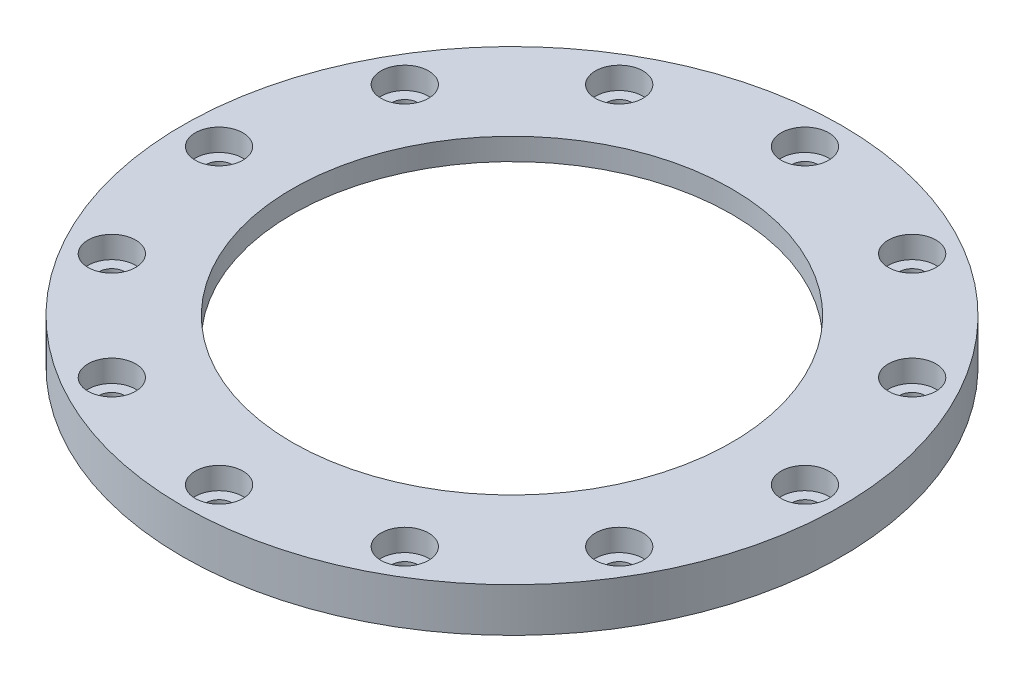
ISO-10303-21;
HEADER;
FILE_DESCRIPTION(('STEP AP214'),'2;1');
FILE_NAME('part.step','',(''),(''),'','','');
FILE_SCHEMA(('AUTOMOTIVE_DESIGN { 1 0 10303 214 1 1 1 1 }'));
ENDSEC;
DATA;
#1=APPLICATION_CONTEXT('core data for automotive mechanical design processes');
#2=APPLICATION_PROTOCOL_DEFINITION('international standard','automotive_design',2000,#1);
#3=PRODUCT_CONTEXT('',#1,'mechanical');
#4=PRODUCT('Part','Part','',(#3));
#5=PRODUCT_RELATED_PRODUCT_CATEGORY('part','',(#4));
#6=PRODUCT_DEFINITION_FORMATION('','',#4);
#7=PRODUCT_DEFINITION_CONTEXT('part definition',#1,'design');
#8=PRODUCT_DEFINITION('design','',#6,#7);
#9=PRODUCT_DEFINITION_SHAPE('','',#8);
#10=(LENGTH_UNIT() NAMED_UNIT(*) SI_UNIT(.MILLI.,.METRE.));
#11=(NAMED_UNIT(*) PLANE_ANGLE_UNIT() SI_UNIT($,.RADIAN.));
#12=(NAMED_UNIT(*) SI_UNIT($,.STERADIAN.) SOLID_ANGLE_UNIT());
#13=UNCERTAINTY_MEASURE_WITH_UNIT(LENGTH_MEASURE(1.E-05),#10,'distance_accuracy_value','');
#14=(GEOMETRIC_REPRESENTATION_CONTEXT(3) GLOBAL_UNCERTAINTY_ASSIGNED_CONTEXT((#13)) GLOBAL_UNIT_ASSIGNED_CONTEXT((#10,
#11,#12)) REPRESENTATION_CONTEXT('',''));
#15=CARTESIAN_POINT('',(0.,0.,0.));
#16=DIRECTION('',(0.,0.,1.));
#17=DIRECTION('',(1.,0.,0.));
#18=AXIS2_PLACEMENT_3D('',#15,#16,#17);
#19=CARTESIAN_POINT('',(0.,6.,-40.));
#20=DIRECTION('',(0.,-1.,0.));
#21=DIRECTION('',(0.,0.,-1.));
#22=AXIS2_PLACEMENT_3D('',#19,#20,#21);
#23=CYLINDRICAL_SURFACE('',#22,1.75);
#24=CARTESIAN_POINT('',(0.,0.,-40.));
#25=DIRECTION('',(0.,1.,0.));
#26=DIRECTION('',(0.,0.,1.));
#27=AXIS2_PLACEMENT_3D('',#24,#25,#26);
#28=CIRCLE('',#27,1.75);
#29=CARTESIAN_POINT('',(0.,0.,-38.25));
#30=VERTEX_POINT('',#29);
#31=EDGE_CURVE('E137',#30,#30,#28,.T.);
#32=ORIENTED_EDGE('',*,*,#31,.F.);
#33=EDGE_LOOP('',(#32));
#34=FACE_BOUND('',#33,.T.);
#35=CARTESIAN_POINT('',(0.,3.,-40.));
#36=DIRECTION('',(0.,1.,0.));
#37=DIRECTION('',(0.,0.,1.));
#38=AXIS2_PLACEMENT_3D('',#35,#36,#37);
#39=CIRCLE('',#38,1.75);
#40=CARTESIAN_POINT('',(0.,3.,-38.25));
#41=VERTEX_POINT('',#40);
#42=EDGE_CURVE('E35',#41,#41,#39,.T.);
#43=ORIENTED_EDGE('',*,*,#42,.T.);
#44=EDGE_LOOP('',(#43));
#45=FACE_BOUND('',#44,.T.);
#46=ADVANCED_FACE('F31',(#34,#45),#23,.F.);
#47=CARTESIAN_POINT('',(20.0000000000008,6.,-34.6410161513804));
#48=DIRECTION('',(0.,-1.,0.));
#49=DIRECTION('',(0.,0.,-1.));
#50=AXIS2_PLACEMENT_3D('',#47,#48,#49);
#51=CYLINDRICAL_SURFACE('',#50,1.74999999999994);
#52=CARTESIAN_POINT('',(20.0000000000008,0.,-34.6410161513804));
#53=DIRECTION('',(0.,1.,0.));
#54=DIRECTION('',(0.,0.,1.));
#55=AXIS2_PLACEMENT_3D('',#52,#53,#54);
#56=CIRCLE('',#55,1.74999999999994);
#57=CARTESIAN_POINT('',(20.0000000000008,0.,-32.8910161513804));
#58=VERTEX_POINT('',#57);
#59=EDGE_CURVE('E135',#58,#58,#56,.T.);
#60=ORIENTED_EDGE('',*,*,#59,.F.);
#61=EDGE_LOOP('',(#60));
#62=FACE_BOUND('',#61,.T.);
#63=CARTESIAN_POINT('',(20.0000000000008,3.,-34.6410161513804));
#64=DIRECTION('',(0.,1.,0.));
#65=DIRECTION('',(0.,0.,1.));
#66=AXIS2_PLACEMENT_3D('',#63,#64,#65);
#67=CIRCLE('',#66,1.74999999999994);
#68=CARTESIAN_POINT('',(20.0000000000008,3.,-32.8910161513804));
#69=VERTEX_POINT('',#68);
#70=EDGE_CURVE('E86',#69,#69,#67,.T.);
#71=ORIENTED_EDGE('',*,*,#70,.T.);
#72=EDGE_LOOP('',(#71));
#73=FACE_BOUND('',#72,.T.);
#74=ADVANCED_FACE('F162',(#62,#73),#51,.F.);
#75=CARTESIAN_POINT('',(34.6410161513804,6.,-20.0000000000049));
#76=DIRECTION('',(0.,-1.,0.));
#77=DIRECTION('',(0.,0.,-1.));
#78=AXIS2_PLACEMENT_3D('',#75,#76,#77);
#79=CYLINDRICAL_SURFACE('',#78,1.75000000000137);
#80=CARTESIAN_POINT('',(34.6410161513804,0.,-20.0000000000049));
#81=DIRECTION('',(0.,1.,0.));
#82=DIRECTION('',(0.,0.,1.));
#83=AXIS2_PLACEMENT_3D('',#80,#81,#82);
#84=CIRCLE('',#83,1.75000000000137);
#85=CARTESIAN_POINT('',(34.6410161513804,0.,-18.2500000000036));
#86=VERTEX_POINT('',#85);
#87=EDGE_CURVE('E132',#86,#86,#84,.T.);
#88=ORIENTED_EDGE('',*,*,#87,.F.);
#89=EDGE_LOOP('',(#88));
#90=FACE_BOUND('',#89,.T.);
#91=CARTESIAN_POINT('',(34.6410161513804,3.,-20.0000000000049));
#92=DIRECTION('',(0.,1.,0.));
#93=DIRECTION('',(0.,0.,1.));
#94=AXIS2_PLACEMENT_3D('',#91,#92,#93);
#95=CIRCLE('',#94,1.75000000000137);
#96=CARTESIAN_POINT('',(34.6410161513804,3.,-18.2500000000036));
#97=VERTEX_POINT('',#96);
#98=EDGE_CURVE('E84',#97,#97,#95,.T.);
#99=ORIENTED_EDGE('',*,*,#98,.T.);
#100=EDGE_LOOP('',(#99));
#101=FACE_BOUND('',#100,.T.);
#102=ADVANCED_FACE('F168',(#90,#101),#79,.F.);
#103=CARTESIAN_POINT('',(34.6410161513861,6.,19.9999999999951));
#104=DIRECTION('',(0.,-1.,0.));
#105=DIRECTION('',(0.,0.,-1.));
#106=AXIS2_PLACEMENT_3D('',#103,#104,#105);
#107=CYLINDRICAL_SURFACE('',#106,1.75000000000689);
#108=CARTESIAN_POINT('',(34.6410161513861,0.,19.9999999999951));
#109=DIRECTION('',(0.,1.,0.));
#110=DIRECTION('',(0.,0.,1.));
#111=AXIS2_PLACEMENT_3D('',#108,#109,#110);
#112=CIRCLE('',#111,1.75000000000689);
#113=CARTESIAN_POINT('',(34.6410161513861,0.,21.750000000002));
#114=VERTEX_POINT('',#113);
#115=EDGE_CURVE('E126',#114,#114,#112,.T.);
#116=ORIENTED_EDGE('',*,*,#115,.F.);
#117=EDGE_LOOP('',(#116));
#118=FACE_BOUND('',#117,.T.);
#119=CARTESIAN_POINT('',(34.6410161513861,3.,19.9999999999951));
#120=DIRECTION('',(0.,1.,0.));
#121=DIRECTION('',(0.,0.,1.));
#122=AXIS2_PLACEMENT_3D('',#119,#120,#121);
#123=CIRCLE('',#122,1.75000000000689);
#124=CARTESIAN_POINT('',(34.6410161513861,3.,21.750000000002));
#125=VERTEX_POINT('',#124);
#126=EDGE_CURVE('E81',#125,#125,#123,.T.);
#127=ORIENTED_EDGE('',*,*,#126,.T.);
#128=EDGE_LOOP('',(#127));
#129=FACE_BOUND('',#128,.T.);
#130=ADVANCED_FACE('F174',(#118,#129),#107,.F.);
#131=CARTESIAN_POINT('',(20.0000000000106,6.,34.6410161513747));
#132=DIRECTION('',(0.,-1.,0.));
#133=DIRECTION('',(0.,0.,-1.));
#134=AXIS2_PLACEMENT_3D('',#131,#132,#133);
#135=CYLINDRICAL_SURFACE('',#134,1.75000000000955);
#136=CARTESIAN_POINT('',(20.0000000000106,0.,34.6410161513747));
#137=DIRECTION('',(0.,1.,0.));
#138=DIRECTION('',(0.,0.,1.));
#139=AXIS2_PLACEMENT_3D('',#136,#137,#138);
#140=CIRCLE('',#139,1.75000000000955);
#141=CARTESIAN_POINT('',(20.0000000000106,0.,36.3910161513842));
#142=VERTEX_POINT('',#141);
#143=EDGE_CURVE('E123',#142,#142,#140,.T.);
#144=ORIENTED_EDGE('',*,*,#143,.F.);
#145=EDGE_LOOP('',(#144));
#146=FACE_BOUND('',#145,.T.);
#147=CARTESIAN_POINT('',(20.0000000000106,3.,34.6410161513747));
#148=DIRECTION('',(0.,1.,0.));
#149=DIRECTION('',(0.,0.,1.));
#150=AXIS2_PLACEMENT_3D('',#147,#148,#149);
#151=CIRCLE('',#150,1.75000000000955);
#152=CARTESIAN_POINT('',(20.0000000000106,3.,36.3910161513842));
#153=VERTEX_POINT('',#152);
#154=EDGE_CURVE('E78',#153,#153,#151,.T.);
#155=ORIENTED_EDGE('',*,*,#154,.T.);
#156=EDGE_LOOP('',(#155));
#157=FACE_BOUND('',#156,.T.);
#158=ADVANCED_FACE('F182',(#146,#157),#135,.F.);
#159=CARTESIAN_POINT('',(1.13588865977684E-11,6.,40.));
#160=DIRECTION('',(0.,-1.,0.));
#161=DIRECTION('',(0.,0.,-1.));
#162=AXIS2_PLACEMENT_3D('',#159,#160,#161);
#163=CYLINDRICAL_SURFACE('',#162,1.75000000001113);
#164=CARTESIAN_POINT('',(1.13588865977684E-11,0.,40.));
#165=DIRECTION('',(0.,1.,0.));
#166=DIRECTION('',(0.,0.,1.));
#167=AXIS2_PLACEMENT_3D('',#164,#165,#166);
#168=CIRCLE('',#167,1.75000000001113);
#169=CARTESIAN_POINT('',(1.13588865977684E-11,0.,41.7500000000111));
#170=VERTEX_POINT('',#169);
#171=EDGE_CURVE('E120',#170,#170,#168,.T.);
#172=ORIENTED_EDGE('',*,*,#171,.F.);
#173=EDGE_LOOP('',(#172));
#174=FACE_BOUND('',#173,.T.);
#175=CARTESIAN_POINT('',(1.13588865977684E-11,3.,40.));
#176=DIRECTION('',(0.,1.,0.));
#177=DIRECTION('',(0.,0.,1.));
#178=AXIS2_PLACEMENT_3D('',#175,#176,#177);
#179=CIRCLE('',#178,1.75000000001113);
#180=CARTESIAN_POINT('',(1.13588865977684E-11,3.,41.7500000000111));
#181=VERTEX_POINT('',#180);
#182=EDGE_CURVE('E75',#181,#181,#179,.T.);
#183=ORIENTED_EDGE('',*,*,#182,.T.);
#184=EDGE_LOOP('',(#183));
#185=FACE_BOUND('',#184,.T.);
#186=ADVANCED_FACE('F186',(#174,#185),#163,.F.);
#187=CARTESIAN_POINT('',(-19.9999999999894,6.,34.6410161513804));
#188=DIRECTION('',(0.,-1.,0.));
#189=DIRECTION('',(0.,0.,-1.));
#190=AXIS2_PLACEMENT_3D('',#187,#188,#189);
#191=CYLINDRICAL_SURFACE('',#190,1.75000000001128);
#192=CARTESIAN_POINT('',(-19.9999999999894,0.,34.6410161513804));
#193=DIRECTION('',(0.,1.,0.));
#194=DIRECTION('',(0.,0.,1.));
#195=AXIS2_PLACEMENT_3D('',#192,#193,#194);
#196=CIRCLE('',#195,1.75000000001128);
#197=CARTESIAN_POINT('',(-19.9999999999894,0.,36.3910161513917));
#198=VERTEX_POINT('',#197);
#199=EDGE_CURVE('E117',#198,#198,#196,.T.);
#200=ORIENTED_EDGE('',*,*,#199,.F.);
#201=EDGE_LOOP('',(#200));
#202=FACE_BOUND('',#201,.T.);
#203=CARTESIAN_POINT('',(-19.9999999999894,3.,34.6410161513804));
#204=DIRECTION('',(0.,1.,0.));
#205=DIRECTION('',(0.,0.,1.));
#206=AXIS2_PLACEMENT_3D('',#203,#204,#205);
#207=CIRCLE('',#206,1.75000000001128);
#208=CARTESIAN_POINT('',(-19.9999999999894,3.,36.3910161513917));
#209=VERTEX_POINT('',#208);
#210=EDGE_CURVE('E72',#209,#209,#207,.T.);
#211=ORIENTED_EDGE('',*,*,#210,.T.);
#212=EDGE_LOOP('',(#211));
#213=FACE_BOUND('',#212,.T.);
#214=ADVANCED_FACE('F190',(#202,#213),#191,.F.);
#215=CARTESIAN_POINT('',(-34.641016151369,6.,20.0000000000049));
#216=DIRECTION('',(0.,-1.,0.));
#217=DIRECTION('',(0.,0.,-1.));
#218=AXIS2_PLACEMENT_3D('',#215,#216,#217);
#219=CYLINDRICAL_SURFACE('',#218,1.75000000000994);
#220=CARTESIAN_POINT('',(-34.641016151369,0.,20.0000000000049));
#221=DIRECTION('',(0.,1.,0.));
#222=DIRECTION('',(0.,0.,1.));
#223=AXIS2_PLACEMENT_3D('',#220,#221,#222);
#224=CIRCLE('',#223,1.75000000000994);
#225=CARTESIAN_POINT('',(-34.641016151369,0.,21.7500000000149));
#226=VERTEX_POINT('',#225);
#227=EDGE_CURVE('E114',#226,#226,#224,.T.);
#228=ORIENTED_EDGE('',*,*,#227,.F.);
#229=EDGE_LOOP('',(#228));
#230=FACE_BOUND('',#229,.T.);
#231=CARTESIAN_POINT('',(-34.641016151369,3.,20.0000000000049));
#232=DIRECTION('',(0.,1.,0.));
#233=DIRECTION('',(0.,0.,1.));
#234=AXIS2_PLACEMENT_3D('',#231,#232,#233);
#235=CIRCLE('',#234,1.75000000000994);
#236=CARTESIAN_POINT('',(-34.641016151369,3.,21.7500000000149));
#237=VERTEX_POINT('',#236);
#238=EDGE_CURVE('E69',#237,#237,#235,.T.);
#239=ORIENTED_EDGE('',*,*,#238,.T.);
#240=EDGE_LOOP('',(#239));
#241=FACE_BOUND('',#240,.T.);
#242=ADVANCED_FACE('F194',(#230,#241),#219,.F.);
#243=CARTESIAN_POINT('',(-39.9999999999943,6.,5.6843418860808E-12));
#244=DIRECTION('',(0.,-1.,0.));
#245=DIRECTION('',(0.,0.,-1.));
#246=AXIS2_PLACEMENT_3D('',#243,#244,#245);
#247=CYLINDRICAL_SURFACE('',#246,1.75000000000749);
#248=CARTESIAN_POINT('',(-39.9999999999943,0.,5.6843418860808E-12));
#249=DIRECTION('',(0.,1.,0.));
#250=DIRECTION('',(0.,0.,1.));
#251=AXIS2_PLACEMENT_3D('',#248,#249,#250);
#252=CIRCLE('',#251,1.75000000000749);
#253=CARTESIAN_POINT('',(-39.9999999999943,0.,1.75000000001318));
#254=VERTEX_POINT('',#253);
#255=EDGE_CURVE('E111',#254,#254,#252,.T.);
#256=ORIENTED_EDGE('',*,*,#255,.F.);
#257=EDGE_LOOP('',(#256));
#258=FACE_BOUND('',#257,.T.);
#259=CARTESIAN_POINT('',(-39.9999999999943,3.,5.6843418860808E-12));
#260=DIRECTION('',(0.,1.,0.));
#261=DIRECTION('',(0.,0.,1.));
#262=AXIS2_PLACEMENT_3D('',#259,#260,#261);
#263=CIRCLE('',#262,1.75000000000749);
#264=CARTESIAN_POINT('',(-39.9999999999943,3.,1.75000000001318));
#265=VERTEX_POINT('',#264);
#266=EDGE_CURVE('E66',#265,#265,#263,.T.);
#267=ORIENTED_EDGE('',*,*,#266,.T.);
#268=EDGE_LOOP('',(#267));
#269=FACE_BOUND('',#268,.T.);
#270=ADVANCED_FACE('F198',(#258,#269),#247,.F.);
#271=CARTESIAN_POINT('',(-34.6410161513747,6.,-19.9999999999951));
#272=DIRECTION('',(0.,-1.,0.));
#273=DIRECTION('',(0.,0.,-1.));
#274=AXIS2_PLACEMENT_3D('',#271,#272,#273);
#275=CYLINDRICAL_SURFACE('',#274,1.75000000000464);
#276=CARTESIAN_POINT('',(-34.6410161513747,0.,-19.9999999999951));
#277=DIRECTION('',(0.,1.,0.));
#278=DIRECTION('',(0.,0.,1.));
#279=AXIS2_PLACEMENT_3D('',#276,#277,#278);
#280=CIRCLE('',#279,1.75000000000464);
#281=CARTESIAN_POINT('',(-34.6410161513747,0.,-18.2499999999904));
#282=VERTEX_POINT('',#281);
#283=EDGE_CURVE('E108',#282,#282,#280,.T.);
#284=ORIENTED_EDGE('',*,*,#283,.F.);
#285=EDGE_LOOP('',(#284));
#286=FACE_BOUND('',#285,.T.);
#287=CARTESIAN_POINT('',(-34.6410161513747,3.,-19.9999999999951));
#288=DIRECTION('',(0.,1.,0.));
#289=DIRECTION('',(0.,0.,1.));
#290=AXIS2_PLACEMENT_3D('',#287,#288,#289);
#291=CIRCLE('',#290,1.75000000000464);
#292=CARTESIAN_POINT('',(-34.6410161513747,3.,-18.2499999999904));
#293=VERTEX_POINT('',#292);
#294=EDGE_CURVE('E62',#293,#293,#291,.T.);
#295=ORIENTED_EDGE('',*,*,#294,.T.);
#296=EDGE_LOOP('',(#295));
#297=FACE_BOUND('',#296,.T.);
#298=ADVANCED_FACE('F202',(#286,#297),#275,.F.);
#299=CARTESIAN_POINT('',(-19.9999999999993,6.,-34.6410161513747));
#300=DIRECTION('',(0.,-1.,0.));
#301=DIRECTION('',(0.,0.,-1.));
#302=AXIS2_PLACEMENT_3D('',#299,#300,#301);
#303=CYLINDRICAL_SURFACE('',#302,1.75000000000208);
#304=CARTESIAN_POINT('',(-19.9999999999993,0.,-34.6410161513747));
#305=DIRECTION('',(0.,1.,0.));
#306=DIRECTION('',(0.,0.,1.));
#307=AXIS2_PLACEMENT_3D('',#304,#305,#306);
#308=CIRCLE('',#307,1.75000000000208);
#309=CARTESIAN_POINT('',(-19.9999999999993,0.,-32.8910161513726));
#310=VERTEX_POINT('',#309);
#311=EDGE_CURVE('E52',#310,#310,#308,.T.);
#312=ORIENTED_EDGE('',*,*,#311,.F.);
#313=EDGE_LOOP('',(#312));
#314=FACE_BOUND('',#313,.T.);
#315=CARTESIAN_POINT('',(-19.9999999999993,3.,-34.6410161513747));
#316=DIRECTION('',(0.,1.,0.));
#317=DIRECTION('',(0.,0.,1.));
#318=AXIS2_PLACEMENT_3D('',#315,#316,#317);
#319=CIRCLE('',#318,1.75000000000208);
#320=CARTESIAN_POINT('',(-19.9999999999993,3.,-32.8910161513726));
#321=VERTEX_POINT('',#320);
#322=EDGE_CURVE('E59',#321,#321,#319,.T.);
#323=ORIENTED_EDGE('',*,*,#322,.T.);
#324=EDGE_LOOP('',(#323));
#325=FACE_BOUND('',#324,.T.);
#326=ADVANCED_FACE('F178',(#314,#325),#303,.F.);
#327=CARTESIAN_POINT('',(40.0000000000057,6.,-5.67944329888421E-12));
#328=DIRECTION('',(0.,-1.,0.));
#329=DIRECTION('',(0.,0.,-1.));
#330=AXIS2_PLACEMENT_3D('',#327,#328,#329);
#331=CYLINDRICAL_SURFACE('',#330,1.75000000000391);
#332=CARTESIAN_POINT('',(40.0000000000057,0.,-5.67944329888421E-12));
#333=DIRECTION('',(0.,1.,0.));
#334=DIRECTION('',(0.,0.,1.));
#335=AXIS2_PLACEMENT_3D('',#332,#333,#334);
#336=CIRCLE('',#335,1.75000000000391);
#337=CARTESIAN_POINT('',(40.0000000000057,0.,1.74999999999823));
#338=VERTEX_POINT('',#337);
#339=EDGE_CURVE('E129',#338,#338,#336,.T.);
#340=ORIENTED_EDGE('',*,*,#339,.F.);
#341=EDGE_LOOP('',(#340));
#342=FACE_BOUND('',#341,.T.);
#343=CARTESIAN_POINT('',(40.0000000000057,3.,-5.67944329888421E-12));
#344=DIRECTION('',(0.,1.,0.));
#345=DIRECTION('',(0.,0.,1.));
#346=AXIS2_PLACEMENT_3D('',#343,#344,#345);
#347=CIRCLE('',#346,1.75000000000391);
#348=CARTESIAN_POINT('',(40.0000000000057,3.,1.74999999999823));
#349=VERTEX_POINT('',#348);
#350=EDGE_CURVE('E54',#349,#349,#347,.T.);
#351=ORIENTED_EDGE('',*,*,#350,.T.);
#352=EDGE_LOOP('',(#351));
#353=FACE_BOUND('',#352,.T.);
#354=ADVANCED_FACE('F157',(#342,#353),#331,.F.);
#355=CARTESIAN_POINT('',(0.,6.,0.));
#356=DIRECTION('',(0.,-1.,0.));
#357=DIRECTION('',(0.,0.,-1.));
#358=AXIS2_PLACEMENT_3D('',#355,#356,#357);
#359=CYLINDRICAL_SURFACE('',#358,30.);
#360=CARTESIAN_POINT('',(0.,6.,0.));
#361=DIRECTION('',(0.,1.,0.));
#362=DIRECTION('',(0.,0.,1.));
#363=AXIS2_PLACEMENT_3D('',#360,#361,#362);
#364=CIRCLE('',#363,30.);
#365=CARTESIAN_POINT('',(0.,6.,30.));
#366=VERTEX_POINT('',#365);
#367=EDGE_CURVE('E44',#366,#366,#364,.T.);
#368=ORIENTED_EDGE('',*,*,#367,.T.);
#369=EDGE_LOOP('',(#368));
#370=FACE_BOUND('',#369,.T.);
#371=CARTESIAN_POINT('',(0.,3.,0.));
#372=DIRECTION('',(0.,-1.,0.));
#373=DIRECTION('',(0.,0.,-1.));
#374=AXIS2_PLACEMENT_3D('',#371,#372,#373);
#375=CIRCLE('',#374,30.);
#376=CARTESIAN_POINT('',(0.,3.,-30.));
#377=VERTEX_POINT('',#376);
#378=EDGE_CURVE('E49',#377,#377,#375,.T.);
#379=ORIENTED_EDGE('',*,*,#378,.T.);
#380=EDGE_LOOP('',(#379));
#381=FACE_BOUND('',#380,.T.);
#382=ADVANCED_FACE('F144',(#370,#381),#359,.F.);
#383=CARTESIAN_POINT('',(0.,6.,0.));
#384=DIRECTION('',(0.,1.,0.));
#385=DIRECTION('',(0.,0.,1.));
#386=AXIS2_PLACEMENT_3D('',#383,#384,#385);
#387=PLANE('',#386);
#388=CARTESIAN_POINT('',(34.6410161513881,6.,19.9999999999987));
#389=DIRECTION('',(0.,1.,0.));
#390=DIRECTION('',(0.,0.,1.));
#391=AXIS2_PLACEMENT_3D('',#388,#389,#390);
#392=CIRCLE('',#391,3.25);
#393=CARTESIAN_POINT('',(34.6410161513881,6.,23.2499999999987));
#394=VERTEX_POINT('',#393);
#395=EDGE_CURVE('E319',#394,#394,#392,.T.);
#396=ORIENTED_EDGE('',*,*,#395,.F.);
#397=EDGE_LOOP('',(#396));
#398=FACE_BOUND('',#397,.T.);
#399=CARTESIAN_POINT('',(20.0000000000125,6.,34.6410161513824));
#400=DIRECTION('',(0.,1.,0.));
#401=DIRECTION('',(0.,0.,1.));
#402=AXIS2_PLACEMENT_3D('',#399,#400,#401);
#403=CIRCLE('',#402,3.25);
#404=CARTESIAN_POINT('',(20.0000000000125,6.,37.8910161513824));
#405=VERTEX_POINT('',#404);
#406=EDGE_CURVE('E327',#405,#405,#403,.T.);
#407=ORIENTED_EDGE('',*,*,#406,.F.);
#408=EDGE_LOOP('',(#407));
#409=FACE_BOUND('',#408,.T.);
#410=CARTESIAN_POINT('',(1.11885987946249E-11,6.,40.0000000000112));
#411=DIRECTION('',(0.,1.,0.));
#412=DIRECTION('',(0.,0.,1.));
#413=AXIS2_PLACEMENT_3D('',#410,#411,#412);
#414=CIRCLE('',#413,3.25);
#415=CARTESIAN_POINT('',(1.11885987946249E-11,6.,43.2500000000112));
#416=VERTEX_POINT('',#415);
#417=EDGE_CURVE('E333',#416,#416,#414,.T.);
#418=ORIENTED_EDGE('',*,*,#417,.F.);
#419=EDGE_LOOP('',(#418));
#420=FACE_BOUND('',#419,.T.);
#421=CARTESIAN_POINT('',(-19.9999999999931,6.,34.6410161513936));
#422=DIRECTION('',(0.,1.,0.));
#423=DIRECTION('',(0.,0.,1.));
#424=AXIS2_PLACEMENT_3D('',#421,#422,#423);
#425=CIRCLE('',#424,3.25);
#426=CARTESIAN_POINT('',(-19.9999999999931,6.,37.8910161513936));
#427=VERTEX_POINT('',#426);
#428=EDGE_CURVE('E339',#427,#427,#425,.T.);
#429=ORIENTED_EDGE('',*,*,#428,.F.);
#430=EDGE_LOOP('',(#429));
#431=FACE_BOUND('',#430,.T.);
#432=CARTESIAN_POINT('',(-34.6410161513769,6.,20.000000000018));
#433=DIRECTION('',(0.,1.,0.));
#434=DIRECTION('',(0.,0.,1.));
#435=AXIS2_PLACEMENT_3D('',#432,#433,#434);
#436=CIRCLE('',#435,3.25);
#437=CARTESIAN_POINT('',(-34.6410161513769,6.,23.250000000018));
#438=VERTEX_POINT('',#437);
#439=EDGE_CURVE('E345',#438,#438,#436,.T.);
#440=ORIENTED_EDGE('',*,*,#439,.F.);
#441=EDGE_LOOP('',(#440));
#442=FACE_BOUND('',#441,.T.);
#443=CARTESIAN_POINT('',(-40.0000000000057,6.,1.66977542903655E-11));
#444=DIRECTION('',(0.,1.,0.));
#445=DIRECTION('',(0.,0.,1.));
#446=AXIS2_PLACEMENT_3D('',#443,#444,#445);
#447=CIRCLE('',#446,3.25);
#448=CARTESIAN_POINT('',(-40.0000000000057,6.,3.2500000000167));
#449=VERTEX_POINT('',#448);
#450=EDGE_CURVE('E351',#449,#449,#447,.T.);
#451=ORIENTED_EDGE('',*,*,#450,.F.);
#452=EDGE_LOOP('',(#451));
#453=FACE_BOUND('',#452,.T.);
#454=CARTESIAN_POINT('',(-34.6410161513881,6.,-19.9999999999876));
#455=DIRECTION('',(0.,1.,0.));
#456=DIRECTION('',(0.,0.,1.));
#457=AXIS2_PLACEMENT_3D('',#454,#455,#456);
#458=CIRCLE('',#457,3.25);
#459=CARTESIAN_POINT('',(-34.6410161513881,6.,-16.7499999999876));
#460=VERTEX_POINT('',#459);
#461=EDGE_CURVE('E357',#460,#460,#458,.T.);
#462=ORIENTED_EDGE('',*,*,#461,.F.);
#463=EDGE_LOOP('',(#462));
#464=FACE_BOUND('',#463,.T.);
#465=CARTESIAN_POINT('',(-20.0000000000125,6.,-34.6410161513714));
#466=DIRECTION('',(0.,1.,0.));
#467=DIRECTION('',(0.,0.,1.));
#468=AXIS2_PLACEMENT_3D('',#465,#466,#467);
#469=CIRCLE('',#468,3.25);
#470=CARTESIAN_POINT('',(-20.0000000000125,6.,-31.3910161513714));
#471=VERTEX_POINT('',#470);
#472=EDGE_CURVE('E363',#471,#471,#469,.T.);
#473=ORIENTED_EDGE('',*,*,#472,.F.);
#474=EDGE_LOOP('',(#473));
#475=FACE_BOUND('',#474,.T.);
#476=CARTESIAN_POINT('',(-1.11934973818215E-11,6.,-40.0000000000002));
#477=DIRECTION('',(0.,1.,0.));
#478=DIRECTION('',(0.,0.,1.));
#479=AXIS2_PLACEMENT_3D('',#476,#477,#478);
#480=CIRCLE('',#479,3.25);
#481=CARTESIAN_POINT('',(-1.11934973818215E-11,6.,-36.7500000000002));
#482=VERTEX_POINT('',#481);
#483=EDGE_CURVE('E369',#482,#482,#480,.T.);
#484=ORIENTED_EDGE('',*,*,#483,.F.);
#485=EDGE_LOOP('',(#484));
#486=FACE_BOUND('',#485,.T.);
#487=CARTESIAN_POINT('',(19.9999999999931,6.,-34.6410161513826));
#488=DIRECTION('',(0.,1.,0.));
#489=DIRECTION('',(0.,0.,1.));
#490=AXIS2_PLACEMENT_3D('',#487,#488,#489);
#491=CIRCLE('',#490,3.25);
#492=CARTESIAN_POINT('',(19.9999999999931,6.,-31.3910161513826));
#493=VERTEX_POINT('',#492);
#494=EDGE_CURVE('E375',#493,#493,#491,.T.);
#495=ORIENTED_EDGE('',*,*,#494,.F.);
#496=EDGE_LOOP('',(#495));
#497=FACE_BOUND('',#496,.T.);
#498=CARTESIAN_POINT('',(34.6410161513769,6.,-20.000000000007));
#499=DIRECTION('',(0.,1.,0.));
#500=DIRECTION('',(0.,0.,1.));
#501=AXIS2_PLACEMENT_3D('',#498,#499,#500);
#502=CIRCLE('',#501,3.25);
#503=CARTESIAN_POINT('',(34.6410161513769,6.,-16.7500000000071));
#504=VERTEX_POINT('',#503);
#505=EDGE_CURVE('E380',#504,#504,#502,.T.);
#506=ORIENTED_EDGE('',*,*,#505,.F.);
#507=EDGE_LOOP('',(#506));
#508=FACE_BOUND('',#507,.T.);
#509=CARTESIAN_POINT('',(40.0000000000057,6.,-5.67944329888421E-12));
#510=DIRECTION('',(0.,1.,0.));
#511=DIRECTION('',(0.,0.,1.));
#512=AXIS2_PLACEMENT_3D('',#509,#510,#511);
#513=CIRCLE('',#512,3.25);
#514=CARTESIAN_POINT('',(40.0000000000057,6.,3.24999999999432));
#515=VERTEX_POINT('',#514);
#516=EDGE_CURVE('E91',#515,#515,#513,.T.);
#517=ORIENTED_EDGE('',*,*,#516,.F.);
#518=EDGE_LOOP('',(#517));
#519=FACE_BOUND('',#518,.T.);
#520=CARTESIAN_POINT('',(0.,6.,0.));
#521=DIRECTION('',(0.,1.,0.));
#522=DIRECTION('',(0.,0.,1.));
#523=AXIS2_PLACEMENT_3D('',#520,#521,#522);
#524=CIRCLE('',#523,45.);
#525=CARTESIAN_POINT('',(0.,6.,45.));
#526=VERTEX_POINT('',#525);
#527=EDGE_CURVE('E10',#526,#526,#524,.T.);
#528=ORIENTED_EDGE('',*,*,#527,.T.);
#529=EDGE_LOOP('',(#528));
#530=FACE_BOUND('',#529,.T.);
#531=ORIENTED_EDGE('',*,*,#367,.F.);
#532=EDGE_LOOP('',(#531));
#533=FACE_BOUND('',#532,.T.);
#534=ADVANCED_FACE('F147',(#398,#409,#420,#431,#442,#453,#464,#475,#486,#497,#508,#519,#530,
#533),#387,.T.);
#535=CARTESIAN_POINT('',(0.,0.,0.));
#536=DIRECTION('',(0.,1.,0.));
#537=DIRECTION('',(0.,0.,1.));
#538=AXIS2_PLACEMENT_3D('',#535,#536,#537);
#539=PLANE('',#538);
#540=CARTESIAN_POINT('',(0.,0.,0.));
#541=DIRECTION('',(0.,-1.,0.));
#542=DIRECTION('',(0.,0.,-1.));
#543=AXIS2_PLACEMENT_3D('',#540,#541,#542);
#544=CIRCLE('',#543,36.);
#545=CARTESIAN_POINT('',(0.,0.,-36.));
#546=VERTEX_POINT('',#545);
#547=EDGE_CURVE('E57',#546,#546,#544,.T.);
#548=ORIENTED_EDGE('',*,*,#547,.F.);
#549=EDGE_LOOP('',(#548));
#550=FACE_BOUND('',#549,.T.);
#551=CARTESIAN_POINT('',(0.,0.,0.));
#552=DIRECTION('',(0.,1.,0.));
#553=DIRECTION('',(0.,0.,1.));
#554=AXIS2_PLACEMENT_3D('',#551,#552,#553);
#555=CIRCLE('',#554,45.);
#556=CARTESIAN_POINT('',(0.,0.,45.));
#557=VERTEX_POINT('',#556);
#558=EDGE_CURVE('E39',#557,#557,#555,.T.);
#559=ORIENTED_EDGE('',*,*,#558,.F.);
#560=EDGE_LOOP('',(#559));
#561=FACE_BOUND('',#560,.T.);
#562=ORIENTED_EDGE('',*,*,#31,.T.);
#563=EDGE_LOOP('',(#562));
#564=FACE_BOUND('',#563,.T.);
#565=ORIENTED_EDGE('',*,*,#59,.T.);
#566=EDGE_LOOP('',(#565));
#567=FACE_BOUND('',#566,.T.);
#568=ORIENTED_EDGE('',*,*,#87,.T.);
#569=EDGE_LOOP('',(#568));
#570=FACE_BOUND('',#569,.T.);
#571=ORIENTED_EDGE('',*,*,#339,.T.);
#572=EDGE_LOOP('',(#571));
#573=FACE_BOUND('',#572,.T.);
#574=ORIENTED_EDGE('',*,*,#115,.T.);
#575=EDGE_LOOP('',(#574));
#576=FACE_BOUND('',#575,.T.);
#577=ORIENTED_EDGE('',*,*,#143,.T.);
#578=EDGE_LOOP('',(#577));
#579=FACE_BOUND('',#578,.T.);
#580=ORIENTED_EDGE('',*,*,#171,.T.);
#581=EDGE_LOOP('',(#580));
#582=FACE_BOUND('',#581,.T.);
#583=ORIENTED_EDGE('',*,*,#199,.T.);
#584=EDGE_LOOP('',(#583));
#585=FACE_BOUND('',#584,.T.);
#586=ORIENTED_EDGE('',*,*,#227,.T.);
#587=EDGE_LOOP('',(#586));
#588=FACE_BOUND('',#587,.T.);
#589=ORIENTED_EDGE('',*,*,#255,.T.);
#590=EDGE_LOOP('',(#589));
#591=FACE_BOUND('',#590,.T.);
#592=ORIENTED_EDGE('',*,*,#283,.T.);
#593=EDGE_LOOP('',(#592));
#594=FACE_BOUND('',#593,.T.);
#595=ORIENTED_EDGE('',*,*,#311,.T.);
#596=EDGE_LOOP('',(#595));
#597=FACE_BOUND('',#596,.T.);
#598=ADVANCED_FACE('F149',(#550,#561,#564,#567,#570,#573,#576,#579,#582,#585,#588,#591,#594,
#597),#539,.F.);
#599=CARTESIAN_POINT('',(0.,6.,0.));
#600=DIRECTION('',(0.,-1.,0.));
#601=DIRECTION('',(0.,0.,-1.));
#602=AXIS2_PLACEMENT_3D('',#599,#600,#601);
#603=CYLINDRICAL_SURFACE('',#602,45.);
#604=ORIENTED_EDGE('',*,*,#527,.F.);
#605=EDGE_LOOP('',(#604));
#606=FACE_BOUND('',#605,.T.);
#607=ORIENTED_EDGE('',*,*,#558,.T.);
#608=EDGE_LOOP('',(#607));
#609=FACE_BOUND('',#608,.T.);
#610=ADVANCED_FACE('F33',(#606,#609),#603,.T.);
#611=CARTESIAN_POINT('',(0.,3.,0.));
#612=DIRECTION('',(0.,-1.,0.));
#613=DIRECTION('',(0.,0.,-1.));
#614=AXIS2_PLACEMENT_3D('',#611,#612,#613);
#615=CYLINDRICAL_SURFACE('',#614,36.);
#616=CARTESIAN_POINT('',(0.,3.,0.));
#617=DIRECTION('',(0.,-1.,0.));
#618=DIRECTION('',(0.,0.,-1.));
#619=AXIS2_PLACEMENT_3D('',#616,#617,#618);
#620=CIRCLE('',#619,36.);
#621=CARTESIAN_POINT('',(0.,3.,-36.));
#622=VERTEX_POINT('',#621);
#623=EDGE_CURVE('E53',#622,#622,#620,.T.);
#624=ORIENTED_EDGE('',*,*,#623,.F.);
#625=EDGE_LOOP('',(#624));
#626=FACE_BOUND('',#625,.T.);
#627=ORIENTED_EDGE('',*,*,#547,.T.);
#628=EDGE_LOOP('',(#627));
#629=FACE_BOUND('',#628,.T.);
#630=ADVANCED_FACE('F210',(#626,#629),#615,.F.);
#631=CARTESIAN_POINT('',(0.,3.,0.));
#632=DIRECTION('',(0.,-1.,0.));
#633=DIRECTION('',(0.,0.,-1.));
#634=AXIS2_PLACEMENT_3D('',#631,#632,#633);
#635=PLANE('',#634);
#636=ORIENTED_EDGE('',*,*,#378,.F.);
#637=EDGE_LOOP('',(#636));
#638=FACE_BOUND('',#637,.T.);
#639=ORIENTED_EDGE('',*,*,#623,.T.);
#640=EDGE_LOOP('',(#639));
#641=FACE_BOUND('',#640,.T.);
#642=ADVANCED_FACE('F213',(#638,#641),#635,.T.);
#643=CARTESIAN_POINT('',(40.0000000000057,3.,-5.67944329888421E-12));
#644=DIRECTION('',(0.,1.,0.));
#645=DIRECTION('',(0.,0.,1.));
#646=AXIS2_PLACEMENT_3D('',#643,#644,#645);
#647=CYLINDRICAL_SURFACE('',#646,3.25);
#648=CARTESIAN_POINT('',(40.0000000000057,3.,-5.67944329888421E-12));
#649=DIRECTION('',(0.,1.,0.));
#650=DIRECTION('',(0.,0.,1.));
#651=AXIS2_PLACEMENT_3D('',#648,#649,#650);
#652=CIRCLE('',#651,3.25);
#653=CARTESIAN_POINT('',(40.0000000000057,3.,3.24999999999432));
#654=VERTEX_POINT('',#653);
#655=EDGE_CURVE('E58',#654,#654,#652,.T.);
#656=ORIENTED_EDGE('',*,*,#655,.F.);
#657=EDGE_LOOP('',(#656));
#658=FACE_BOUND('',#657,.T.);
#659=ORIENTED_EDGE('',*,*,#516,.T.);
#660=EDGE_LOOP('',(#659));
#661=FACE_BOUND('',#660,.T.);
#662=ADVANCED_FACE('F217',(#658,#661),#647,.F.);
#663=CARTESIAN_POINT('',(40.0000000000057,3.,-5.67944329888421E-12));
#664=DIRECTION('',(0.,1.,0.));
#665=DIRECTION('',(0.,0.,1.));
#666=AXIS2_PLACEMENT_3D('',#663,#664,#665);
#667=PLANE('',#666);
#668=ORIENTED_EDGE('',*,*,#350,.F.);
#669=EDGE_LOOP('',(#668));
#670=FACE_BOUND('',#669,.T.);
#671=ORIENTED_EDGE('',*,*,#655,.T.);
#672=EDGE_LOOP('',(#671));
#673=FACE_BOUND('',#672,.T.);
#674=ADVANCED_FACE('F221',(#670,#673),#667,.T.);
#675=CARTESIAN_POINT('',(-20.0000000000125,3.,-34.6410161513714));
#676=DIRECTION('',(0.,1.,0.));
#677=DIRECTION('',(0.,0.,1.));
#678=AXIS2_PLACEMENT_3D('',#675,#676,#677);
#679=CYLINDRICAL_SURFACE('',#678,3.25);
#680=CARTESIAN_POINT('',(-20.0000000000125,3.,-34.6410161513714));
#681=DIRECTION('',(0.,1.,0.));
#682=DIRECTION('',(0.,0.,1.));
#683=AXIS2_PLACEMENT_3D('',#680,#681,#682);
#684=CIRCLE('',#683,3.25);
#685=CARTESIAN_POINT('',(-20.0000000000125,3.,-31.3910161513714));
#686=VERTEX_POINT('',#685);
#687=EDGE_CURVE('E360',#686,#686,#684,.T.);
#688=ORIENTED_EDGE('',*,*,#687,.F.);
#689=EDGE_LOOP('',(#688));
#690=FACE_BOUND('',#689,.T.);
#691=ORIENTED_EDGE('',*,*,#472,.T.);
#692=EDGE_LOOP('',(#691));
#693=FACE_BOUND('',#692,.T.);
#694=ADVANCED_FACE('F225',(#690,#693),#679,.F.);
#695=CARTESIAN_POINT('',(-20.0000000000125,3.,-34.6410161513714));
#696=DIRECTION('',(0.,1.,0.));
#697=DIRECTION('',(0.,0.,1.));
#698=AXIS2_PLACEMENT_3D('',#695,#696,#697);
#699=PLANE('',#698);
#700=ORIENTED_EDGE('',*,*,#322,.F.);
#701=EDGE_LOOP('',(#700));
#702=FACE_BOUND('',#701,.T.);
#703=ORIENTED_EDGE('',*,*,#687,.T.);
#704=EDGE_LOOP('',(#703));
#705=FACE_BOUND('',#704,.T.);
#706=ADVANCED_FACE('F254',(#702,#705),#699,.T.);
#707=CARTESIAN_POINT('',(-34.6410161513881,3.,-19.9999999999876));
#708=DIRECTION('',(0.,1.,0.));
#709=DIRECTION('',(0.,0.,1.));
#710=AXIS2_PLACEMENT_3D('',#707,#708,#709);
#711=CYLINDRICAL_SURFACE('',#710,3.25);
#712=CARTESIAN_POINT('',(-34.6410161513881,3.,-19.9999999999876));
#713=DIRECTION('',(0.,1.,0.));
#714=DIRECTION('',(0.,0.,1.));
#715=AXIS2_PLACEMENT_3D('',#712,#713,#714);
#716=CIRCLE('',#715,3.25);
#717=CARTESIAN_POINT('',(-34.6410161513881,3.,-16.7499999999876));
#718=VERTEX_POINT('',#717);
#719=EDGE_CURVE('E354',#718,#718,#716,.T.);
#720=ORIENTED_EDGE('',*,*,#719,.F.);
#721=EDGE_LOOP('',(#720));
#722=FACE_BOUND('',#721,.T.);
#723=ORIENTED_EDGE('',*,*,#461,.T.);
#724=EDGE_LOOP('',(#723));
#725=FACE_BOUND('',#724,.T.);
#726=ADVANCED_FACE('F258',(#722,#725),#711,.F.);
#727=CARTESIAN_POINT('',(-34.6410161513881,3.,-19.9999999999876));
#728=DIRECTION('',(0.,1.,0.));
#729=DIRECTION('',(0.,0.,1.));
#730=AXIS2_PLACEMENT_3D('',#727,#728,#729);
#731=PLANE('',#730);
#732=ORIENTED_EDGE('',*,*,#294,.F.);
#733=EDGE_LOOP('',(#732));
#734=FACE_BOUND('',#733,.T.);
#735=ORIENTED_EDGE('',*,*,#719,.T.);
#736=EDGE_LOOP('',(#735));
#737=FACE_BOUND('',#736,.T.);
#738=ADVANCED_FACE('F262',(#734,#737),#731,.T.);
#739=CARTESIAN_POINT('',(-40.0000000000057,3.,1.66977542903655E-11));
#740=DIRECTION('',(0.,1.,0.));
#741=DIRECTION('',(0.,0.,1.));
#742=AXIS2_PLACEMENT_3D('',#739,#740,#741);
#743=CYLINDRICAL_SURFACE('',#742,3.25);
#744=CARTESIAN_POINT('',(-40.0000000000057,3.,1.66977542903655E-11));
#745=DIRECTION('',(0.,1.,0.));
#746=DIRECTION('',(0.,0.,1.));
#747=AXIS2_PLACEMENT_3D('',#744,#745,#746);
#748=CIRCLE('',#747,3.25);
#749=CARTESIAN_POINT('',(-40.0000000000057,3.,3.2500000000167));
#750=VERTEX_POINT('',#749);
#751=EDGE_CURVE('E348',#750,#750,#748,.T.);
#752=ORIENTED_EDGE('',*,*,#751,.F.);
#753=EDGE_LOOP('',(#752));
#754=FACE_BOUND('',#753,.T.);
#755=ORIENTED_EDGE('',*,*,#450,.T.);
#756=EDGE_LOOP('',(#755));
#757=FACE_BOUND('',#756,.T.);
#758=ADVANCED_FACE('F266',(#754,#757),#743,.F.);
#759=CARTESIAN_POINT('',(-40.0000000000057,3.,1.66977542903655E-11));
#760=DIRECTION('',(0.,1.,0.));
#761=DIRECTION('',(0.,0.,1.));
#762=AXIS2_PLACEMENT_3D('',#759,#760,#761);
#763=PLANE('',#762);
#764=ORIENTED_EDGE('',*,*,#266,.F.);
#765=EDGE_LOOP('',(#764));
#766=FACE_BOUND('',#765,.T.);
#767=ORIENTED_EDGE('',*,*,#751,.T.);
#768=EDGE_LOOP('',(#767));
#769=FACE_BOUND('',#768,.T.);
#770=ADVANCED_FACE('F270',(#766,#769),#763,.T.);
#771=CARTESIAN_POINT('',(-34.6410161513769,3.,20.000000000018));
#772=DIRECTION('',(0.,1.,0.));
#773=DIRECTION('',(0.,0.,1.));
#774=AXIS2_PLACEMENT_3D('',#771,#772,#773);
#775=CYLINDRICAL_SURFACE('',#774,3.25);
#776=CARTESIAN_POINT('',(-34.6410161513769,3.,20.000000000018));
#777=DIRECTION('',(0.,1.,0.));
#778=DIRECTION('',(0.,0.,1.));
#779=AXIS2_PLACEMENT_3D('',#776,#777,#778);
#780=CIRCLE('',#779,3.25);
#781=CARTESIAN_POINT('',(-34.6410161513769,3.,23.250000000018));
#782=VERTEX_POINT('',#781);
#783=EDGE_CURVE('E342',#782,#782,#780,.T.);
#784=ORIENTED_EDGE('',*,*,#783,.F.);
#785=EDGE_LOOP('',(#784));
#786=FACE_BOUND('',#785,.T.);
#787=ORIENTED_EDGE('',*,*,#439,.T.);
#788=EDGE_LOOP('',(#787));
#789=FACE_BOUND('',#788,.T.);
#790=ADVANCED_FACE('F274',(#786,#789),#775,.F.);
#791=CARTESIAN_POINT('',(-34.6410161513769,3.,20.000000000018));
#792=DIRECTION('',(0.,1.,0.));
#793=DIRECTION('',(0.,0.,1.));
#794=AXIS2_PLACEMENT_3D('',#791,#792,#793);
#795=PLANE('',#794);
#796=ORIENTED_EDGE('',*,*,#238,.F.);
#797=EDGE_LOOP('',(#796));
#798=FACE_BOUND('',#797,.T.);
#799=ORIENTED_EDGE('',*,*,#783,.T.);
#800=EDGE_LOOP('',(#799));
#801=FACE_BOUND('',#800,.T.);
#802=ADVANCED_FACE('F278',(#798,#801),#795,.T.);
#803=CARTESIAN_POINT('',(-19.9999999999931,3.,34.6410161513936));
#804=DIRECTION('',(0.,1.,0.));
#805=DIRECTION('',(0.,0.,1.));
#806=AXIS2_PLACEMENT_3D('',#803,#804,#805);
#807=CYLINDRICAL_SURFACE('',#806,3.25);
#808=CARTESIAN_POINT('',(-19.9999999999931,3.,34.6410161513936));
#809=DIRECTION('',(0.,1.,0.));
#810=DIRECTION('',(0.,0.,1.));
#811=AXIS2_PLACEMENT_3D('',#808,#809,#810);
#812=CIRCLE('',#811,3.25);
#813=CARTESIAN_POINT('',(-19.9999999999931,3.,37.8910161513936));
#814=VERTEX_POINT('',#813);
#815=EDGE_CURVE('E336',#814,#814,#812,.T.);
#816=ORIENTED_EDGE('',*,*,#815,.F.);
#817=EDGE_LOOP('',(#816));
#818=FACE_BOUND('',#817,.T.);
#819=ORIENTED_EDGE('',*,*,#428,.T.);
#820=EDGE_LOOP('',(#819));
#821=FACE_BOUND('',#820,.T.);
#822=ADVANCED_FACE('F282',(#818,#821),#807,.F.);
#823=CARTESIAN_POINT('',(-19.9999999999931,3.,34.6410161513936));
#824=DIRECTION('',(0.,1.,0.));
#825=DIRECTION('',(0.,0.,1.));
#826=AXIS2_PLACEMENT_3D('',#823,#824,#825);
#827=PLANE('',#826);
#828=ORIENTED_EDGE('',*,*,#210,.F.);
#829=EDGE_LOOP('',(#828));
#830=FACE_BOUND('',#829,.T.);
#831=ORIENTED_EDGE('',*,*,#815,.T.);
#832=EDGE_LOOP('',(#831));
#833=FACE_BOUND('',#832,.T.);
#834=ADVANCED_FACE('F286',(#830,#833),#827,.T.);
#835=CARTESIAN_POINT('',(1.11885987946249E-11,3.,40.0000000000112));
#836=DIRECTION('',(0.,1.,0.));
#837=DIRECTION('',(0.,0.,1.));
#838=AXIS2_PLACEMENT_3D('',#835,#836,#837);
#839=CYLINDRICAL_SURFACE('',#838,3.25);
#840=CARTESIAN_POINT('',(1.11885987946249E-11,3.,40.0000000000112));
#841=DIRECTION('',(0.,1.,0.));
#842=DIRECTION('',(0.,0.,1.));
#843=AXIS2_PLACEMENT_3D('',#840,#841,#842);
#844=CIRCLE('',#843,3.25);
#845=CARTESIAN_POINT('',(1.11885987946249E-11,3.,43.2500000000112));
#846=VERTEX_POINT('',#845);
#847=EDGE_CURVE('E330',#846,#846,#844,.T.);
#848=ORIENTED_EDGE('',*,*,#847,.F.);
#849=EDGE_LOOP('',(#848));
#850=FACE_BOUND('',#849,.T.);
#851=ORIENTED_EDGE('',*,*,#417,.T.);
#852=EDGE_LOOP('',(#851));
#853=FACE_BOUND('',#852,.T.);
#854=ADVANCED_FACE('F290',(#850,#853),#839,.F.);
#855=CARTESIAN_POINT('',(1.11885987946249E-11,3.,40.0000000000112));
#856=DIRECTION('',(0.,1.,0.));
#857=DIRECTION('',(0.,0.,1.));
#858=AXIS2_PLACEMENT_3D('',#855,#856,#857);
#859=PLANE('',#858);
#860=ORIENTED_EDGE('',*,*,#182,.F.);
#861=EDGE_LOOP('',(#860));
#862=FACE_BOUND('',#861,.T.);
#863=ORIENTED_EDGE('',*,*,#847,.T.);
#864=EDGE_LOOP('',(#863));
#865=FACE_BOUND('',#864,.T.);
#866=ADVANCED_FACE('F294',(#862,#865),#859,.T.);
#867=CARTESIAN_POINT('',(20.0000000000125,3.,34.6410161513824));
#868=DIRECTION('',(0.,1.,0.));
#869=DIRECTION('',(0.,0.,1.));
#870=AXIS2_PLACEMENT_3D('',#867,#868,#869);
#871=CYLINDRICAL_SURFACE('',#870,3.25);
#872=CARTESIAN_POINT('',(20.0000000000125,3.,34.6410161513824));
#873=DIRECTION('',(0.,1.,0.));
#874=DIRECTION('',(0.,0.,1.));
#875=AXIS2_PLACEMENT_3D('',#872,#873,#874);
#876=CIRCLE('',#875,3.25);
#877=CARTESIAN_POINT('',(20.0000000000125,3.,37.8910161513824));
#878=VERTEX_POINT('',#877);
#879=EDGE_CURVE('E322',#878,#878,#876,.T.);
#880=ORIENTED_EDGE('',*,*,#879,.F.);
#881=EDGE_LOOP('',(#880));
#882=FACE_BOUND('',#881,.T.);
#883=ORIENTED_EDGE('',*,*,#406,.T.);
#884=EDGE_LOOP('',(#883));
#885=FACE_BOUND('',#884,.T.);
#886=ADVANCED_FACE('F298',(#882,#885),#871,.F.);
#887=CARTESIAN_POINT('',(20.0000000000125,3.,34.6410161513824));
#888=DIRECTION('',(0.,1.,0.));
#889=DIRECTION('',(0.,0.,1.));
#890=AXIS2_PLACEMENT_3D('',#887,#888,#889);
#891=PLANE('',#890);
#892=ORIENTED_EDGE('',*,*,#154,.F.);
#893=EDGE_LOOP('',(#892));
#894=FACE_BOUND('',#893,.T.);
#895=ORIENTED_EDGE('',*,*,#879,.T.);
#896=EDGE_LOOP('',(#895));
#897=FACE_BOUND('',#896,.T.);
#898=ADVANCED_FACE('F302',(#894,#897),#891,.T.);
#899=CARTESIAN_POINT('',(34.6410161513881,3.,19.9999999999987));
#900=DIRECTION('',(0.,1.,0.));
#901=DIRECTION('',(0.,0.,1.));
#902=AXIS2_PLACEMENT_3D('',#899,#900,#901);
#903=CYLINDRICAL_SURFACE('',#902,3.25);
#904=CARTESIAN_POINT('',(34.6410161513881,3.,19.9999999999987));
#905=DIRECTION('',(0.,1.,0.));
#906=DIRECTION('',(0.,0.,1.));
#907=AXIS2_PLACEMENT_3D('',#904,#905,#906);
#908=CIRCLE('',#907,3.25);
#909=CARTESIAN_POINT('',(34.6410161513881,3.,23.2499999999987));
#910=VERTEX_POINT('',#909);
#911=EDGE_CURVE('E63',#910,#910,#908,.T.);
#912=ORIENTED_EDGE('',*,*,#911,.F.);
#913=EDGE_LOOP('',(#912));
#914=FACE_BOUND('',#913,.T.);
#915=ORIENTED_EDGE('',*,*,#395,.T.);
#916=EDGE_LOOP('',(#915));
#917=FACE_BOUND('',#916,.T.);
#918=ADVANCED_FACE('F306',(#914,#917),#903,.F.);
#919=CARTESIAN_POINT('',(34.6410161513881,3.,19.9999999999987));
#920=DIRECTION('',(0.,1.,0.));
#921=DIRECTION('',(0.,0.,1.));
#922=AXIS2_PLACEMENT_3D('',#919,#920,#921);
#923=PLANE('',#922);
#924=ORIENTED_EDGE('',*,*,#126,.F.);
#925=EDGE_LOOP('',(#924));
#926=FACE_BOUND('',#925,.T.);
#927=ORIENTED_EDGE('',*,*,#911,.T.);
#928=EDGE_LOOP('',(#927));
#929=FACE_BOUND('',#928,.T.);
#930=ADVANCED_FACE('F231',(#926,#929),#923,.T.);
#931=CARTESIAN_POINT('',(34.6410161513769,3.,-20.000000000007));
#932=DIRECTION('',(0.,1.,0.));
#933=DIRECTION('',(0.,0.,1.));
#934=AXIS2_PLACEMENT_3D('',#931,#932,#933);
#935=CYLINDRICAL_SURFACE('',#934,3.25);
#936=CARTESIAN_POINT('',(34.6410161513769,3.,-20.000000000007));
#937=DIRECTION('',(0.,1.,0.));
#938=DIRECTION('',(0.,0.,1.));
#939=AXIS2_PLACEMENT_3D('',#936,#937,#938);
#940=CIRCLE('',#939,3.25);
#941=CARTESIAN_POINT('',(34.6410161513769,3.,-16.7500000000071));
#942=VERTEX_POINT('',#941);
#943=EDGE_CURVE('E378',#942,#942,#940,.T.);
#944=ORIENTED_EDGE('',*,*,#943,.F.);
#945=EDGE_LOOP('',(#944));
#946=FACE_BOUND('',#945,.T.);
#947=ORIENTED_EDGE('',*,*,#505,.T.);
#948=EDGE_LOOP('',(#947));
#949=FACE_BOUND('',#948,.T.);
#950=ADVANCED_FACE('F227',(#946,#949),#935,.F.);
#951=CARTESIAN_POINT('',(34.6410161513769,3.,-20.000000000007));
#952=DIRECTION('',(0.,1.,0.));
#953=DIRECTION('',(0.,0.,1.));
#954=AXIS2_PLACEMENT_3D('',#951,#952,#953);
#955=PLANE('',#954);
#956=ORIENTED_EDGE('',*,*,#98,.F.);
#957=EDGE_LOOP('',(#956));
#958=FACE_BOUND('',#957,.T.);
#959=ORIENTED_EDGE('',*,*,#943,.T.);
#960=EDGE_LOOP('',(#959));
#961=FACE_BOUND('',#960,.T.);
#962=ADVANCED_FACE('F230',(#958,#961),#955,.T.);
#963=CARTESIAN_POINT('',(19.9999999999931,3.,-34.6410161513826));
#964=DIRECTION('',(0.,1.,0.));
#965=DIRECTION('',(0.,0.,1.));
#966=AXIS2_PLACEMENT_3D('',#963,#964,#965);
#967=CYLINDRICAL_SURFACE('',#966,3.25);
#968=CARTESIAN_POINT('',(19.9999999999931,3.,-34.6410161513826));
#969=DIRECTION('',(0.,1.,0.));
#970=DIRECTION('',(0.,0.,1.));
#971=AXIS2_PLACEMENT_3D('',#968,#969,#970);
#972=CIRCLE('',#971,3.25);
#973=CARTESIAN_POINT('',(19.9999999999931,3.,-31.3910161513826));
#974=VERTEX_POINT('',#973);
#975=EDGE_CURVE('E372',#974,#974,#972,.T.);
#976=ORIENTED_EDGE('',*,*,#975,.F.);
#977=EDGE_LOOP('',(#976));
#978=FACE_BOUND('',#977,.T.);
#979=ORIENTED_EDGE('',*,*,#494,.T.);
#980=EDGE_LOOP('',(#979));
#981=FACE_BOUND('',#980,.T.);
#982=ADVANCED_FACE('F235',(#978,#981),#967,.F.);
#983=CARTESIAN_POINT('',(19.9999999999931,3.,-34.6410161513826));
#984=DIRECTION('',(0.,1.,0.));
#985=DIRECTION('',(0.,0.,1.));
#986=AXIS2_PLACEMENT_3D('',#983,#984,#985);
#987=PLANE('',#986);
#988=ORIENTED_EDGE('',*,*,#70,.F.);
#989=EDGE_LOOP('',(#988));
#990=FACE_BOUND('',#989,.T.);
#991=ORIENTED_EDGE('',*,*,#975,.T.);
#992=EDGE_LOOP('',(#991));
#993=FACE_BOUND('',#992,.T.);
#994=ADVANCED_FACE('F239',(#990,#993),#987,.T.);
#995=CARTESIAN_POINT('',(-1.11934973818215E-11,3.,-40.0000000000002));
#996=DIRECTION('',(0.,1.,0.));
#997=DIRECTION('',(0.,0.,1.));
#998=AXIS2_PLACEMENT_3D('',#995,#996,#997);
#999=CYLINDRICAL_SURFACE('',#998,3.25);
#1000=CARTESIAN_POINT('',(-1.11934973818215E-11,3.,-40.0000000000002));
#1001=DIRECTION('',(0.,1.,0.));
#1002=DIRECTION('',(0.,0.,1.));
#1003=AXIS2_PLACEMENT_3D('',#1000,#1001,#1002);
#1004=CIRCLE('',#1003,3.25);
#1005=CARTESIAN_POINT('',(-1.11934973818215E-11,3.,-36.7500000000002));
#1006=VERTEX_POINT('',#1005);
#1007=EDGE_CURVE('E366',#1006,#1006,#1004,.T.);
#1008=ORIENTED_EDGE('',*,*,#1007,.F.);
#1009=EDGE_LOOP('',(#1008));
#1010=FACE_BOUND('',#1009,.T.);
#1011=ORIENTED_EDGE('',*,*,#483,.T.);
#1012=EDGE_LOOP('',(#1011));
#1013=FACE_BOUND('',#1012,.T.);
#1014=ADVANCED_FACE('F243',(#1010,#1013),#999,.F.);
#1015=CARTESIAN_POINT('',(-1.11934973818215E-11,3.,-40.0000000000002));
#1016=DIRECTION('',(0.,1.,0.));
#1017=DIRECTION('',(0.,0.,1.));
#1018=AXIS2_PLACEMENT_3D('',#1015,#1016,#1017);
#1019=PLANE('',#1018);
#1020=ORIENTED_EDGE('',*,*,#42,.F.);
#1021=EDGE_LOOP('',(#1020));
#1022=FACE_BOUND('',#1021,.T.);
#1023=ORIENTED_EDGE('',*,*,#1007,.T.);
#1024=EDGE_LOOP('',(#1023));
#1025=FACE_BOUND('',#1024,.T.);
#1026=ADVANCED_FACE('F247',(#1022,#1025),#1019,.T.);
#1027=CLOSED_SHELL('',(#46,#74,#102,#130,#158,#186,#214,#242,#270,#298,#326,#354,#382,#534,#598,
#610,#630,#642,#662,#674,#694,#706,#726,#738,#758,#770,#790,#802,#822,#834,#854,#866,#886,#898,
#918,#930,#950,#962,#982,#994,#1014,#1026));
#1028=MANIFOLD_SOLID_BREP('B2',#1027);
#1029=ADVANCED_BREP_SHAPE_REPRESENTATION('',(#18,#1028),#14);
#1030=SHAPE_DEFINITION_REPRESENTATION(#9,#1029);
ENDSEC;
END-ISO-10303-21;
